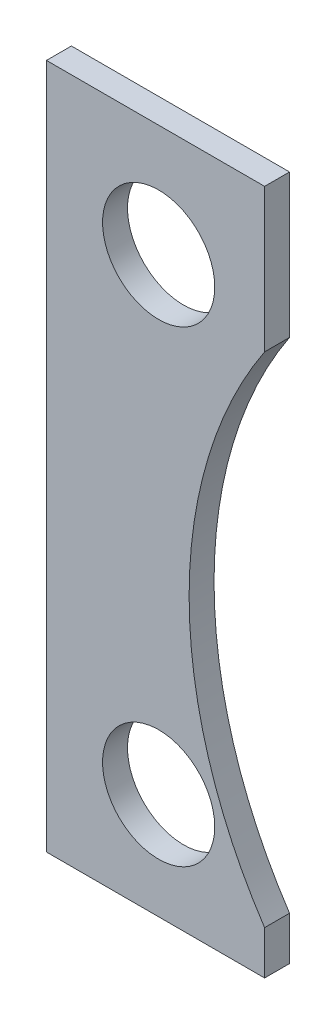
ISO-10303-21;
HEADER;
FILE_DESCRIPTION(('STEP AP214'),'2;1');
FILE_NAME('part.step','',(''),(''),'','','');
FILE_SCHEMA(('AUTOMOTIVE_DESIGN { 1 0 10303 214 1 1 1 1 }'));
ENDSEC;
DATA;
#1=APPLICATION_CONTEXT('core data for automotive mechanical design processes');
#2=APPLICATION_PROTOCOL_DEFINITION('international standard','automotive_design',2000,#1);
#3=PRODUCT_CONTEXT('',#1,'mechanical');
#4=PRODUCT('Part','Part','',(#3));
#5=PRODUCT_RELATED_PRODUCT_CATEGORY('part','',(#4));
#6=PRODUCT_DEFINITION_FORMATION('','',#4);
#7=PRODUCT_DEFINITION_CONTEXT('part definition',#1,'design');
#8=PRODUCT_DEFINITION('design','',#6,#7);
#9=PRODUCT_DEFINITION_SHAPE('','',#8);
#10=(LENGTH_UNIT() NAMED_UNIT(*) SI_UNIT(.MILLI.,.METRE.));
#11=(NAMED_UNIT(*) PLANE_ANGLE_UNIT() SI_UNIT($,.RADIAN.));
#12=(NAMED_UNIT(*) SI_UNIT($,.STERADIAN.) SOLID_ANGLE_UNIT());
#13=UNCERTAINTY_MEASURE_WITH_UNIT(LENGTH_MEASURE(1.E-05),#10,'distance_accuracy_value','');
#14=(GEOMETRIC_REPRESENTATION_CONTEXT(3) GLOBAL_UNCERTAINTY_ASSIGNED_CONTEXT((#13)) GLOBAL_UNIT_ASSIGNED_CONTEXT((#10,
#11,#12)) REPRESENTATION_CONTEXT('',''));
#15=CARTESIAN_POINT('',(0.,0.,0.));
#16=DIRECTION('',(0.,0.,1.));
#17=DIRECTION('',(1.,0.,0.));
#18=AXIS2_PLACEMENT_3D('',#15,#16,#17);
#19=CARTESIAN_POINT('',(0.,110.,2.));
#20=DIRECTION('',(1.,0.,0.));
#21=DIRECTION('',(0.,1.,0.));
#22=AXIS2_PLACEMENT_3D('',#19,#20,#21);
#23=PLANE('',#22);
#24=DIRECTION('',(0.,-1.,0.));
#25=VECTOR('',#24,1.);
#26=CARTESIAN_POINT('',(0.,110.,-2.));
#27=LINE('',#26,#25);
#28=CARTESIAN_POINT('',(0.,110.,-2.));
#29=VERTEX_POINT('',#28);
#30=CARTESIAN_POINT('',(0.,0.,-2.));
#31=VERTEX_POINT('',#30);
#32=EDGE_CURVE('E121',#29,#31,#27,.T.);
#33=ORIENTED_EDGE('',*,*,#32,.T.);
#34=DIRECTION('',(0.,0.,-1.));
#35=VECTOR('',#34,1.);
#36=CARTESIAN_POINT('',(0.,0.,2.));
#37=LINE('',#36,#35);
#38=CARTESIAN_POINT('',(0.,0.,2.));
#39=VERTEX_POINT('',#38);
#40=EDGE_CURVE('E11',#39,#31,#37,.T.);
#41=ORIENTED_EDGE('',*,*,#40,.F.);
#42=DIRECTION('',(0.,-1.,0.));
#43=VECTOR('',#42,1.);
#44=CARTESIAN_POINT('',(0.,110.,2.));
#45=LINE('',#44,#43);
#46=CARTESIAN_POINT('',(0.,110.,2.));
#47=VERTEX_POINT('',#46);
#48=EDGE_CURVE('E132',#47,#39,#45,.T.);
#49=ORIENTED_EDGE('',*,*,#48,.F.);
#50=DIRECTION('',(0.,0.,-1.));
#51=VECTOR('',#50,1.);
#52=CARTESIAN_POINT('',(0.,110.,2.));
#53=LINE('',#52,#51);
#54=EDGE_CURVE('E117',#47,#29,#53,.T.);
#55=ORIENTED_EDGE('',*,*,#54,.T.);
#56=EDGE_LOOP('',(#33,#41,#49,#55));
#57=FACE_BOUND('',#56,.T.);
#58=ADVANCED_FACE('F37',(#57),#23,.F.);
#59=CARTESIAN_POINT('',(0.,0.,2.));
#60=DIRECTION('',(0.,1.,0.));
#61=DIRECTION('',(0.,0.,1.));
#62=AXIS2_PLACEMENT_3D('',#59,#60,#61);
#63=PLANE('',#62);
#64=DIRECTION('',(1.,0.,0.));
#65=VECTOR('',#64,1.);
#66=CARTESIAN_POINT('',(0.,0.,-2.));
#67=LINE('',#66,#65);
#68=CARTESIAN_POINT('',(35.,0.,-2.));
#69=VERTEX_POINT('',#68);
#70=EDGE_CURVE('E124',#31,#69,#67,.T.);
#71=ORIENTED_EDGE('',*,*,#70,.T.);
#72=DIRECTION('',(0.,0.,-1.));
#73=VECTOR('',#72,1.);
#74=CARTESIAN_POINT('',(35.,0.,2.));
#75=LINE('',#74,#73);
#76=CARTESIAN_POINT('',(35.,0.,2.));
#77=VERTEX_POINT('',#76);
#78=EDGE_CURVE('E45',#77,#69,#75,.T.);
#79=ORIENTED_EDGE('',*,*,#78,.F.);
#80=DIRECTION('',(1.,0.,0.));
#81=VECTOR('',#80,1.);
#82=CARTESIAN_POINT('',(0.,0.,2.));
#83=LINE('',#82,#81);
#84=EDGE_CURVE('E90',#39,#77,#83,.T.);
#85=ORIENTED_EDGE('',*,*,#84,.F.);
#86=ORIENTED_EDGE('',*,*,#40,.T.);
#87=EDGE_LOOP('',(#71,#79,#85,#86));
#88=FACE_BOUND('',#87,.T.);
#89=ADVANCED_FACE('F157',(#88),#63,.F.);
#90=CARTESIAN_POINT('',(35.,7.,2.));
#91=DIRECTION('',(-1.,0.,0.));
#92=DIRECTION('',(0.,-1.,0.));
#93=AXIS2_PLACEMENT_3D('',#90,#91,#92);
#94=PLANE('',#93);
#95=DIRECTION('',(0.,1.,0.));
#96=VECTOR('',#95,1.);
#97=CARTESIAN_POINT('',(35.,7.,-2.));
#98=LINE('',#97,#96);
#99=CARTESIAN_POINT('',(35.,7.00000000000003,-2.));
#100=VERTEX_POINT('',#99);
#101=EDGE_CURVE('E127',#69,#100,#98,.T.);
#102=ORIENTED_EDGE('',*,*,#101,.T.);
#103=DIRECTION('',(0.,0.,-1.));
#104=VECTOR('',#103,1.);
#105=CARTESIAN_POINT('',(35.,7.00000000000003,2.));
#106=LINE('',#105,#104);
#107=CARTESIAN_POINT('',(35.,7.00000000000003,2.));
#108=VERTEX_POINT('',#107);
#109=EDGE_CURVE('E112',#108,#100,#106,.T.);
#110=ORIENTED_EDGE('',*,*,#109,.F.);
#111=DIRECTION('',(0.,1.,0.));
#112=VECTOR('',#111,1.);
#113=CARTESIAN_POINT('',(35.,7.,2.));
#114=LINE('',#113,#112);
#115=EDGE_CURVE('E103',#77,#108,#114,.T.);
#116=ORIENTED_EDGE('',*,*,#115,.F.);
#117=ORIENTED_EDGE('',*,*,#78,.T.);
#118=EDGE_LOOP('',(#102,#110,#116,#117));
#119=FACE_BOUND('',#118,.T.);
#120=ADVANCED_FACE('F138',(#119),#94,.F.);
#121=CARTESIAN_POINT('',(95.0000000000002,47.,2.));
#122=DIRECTION('',(0.,0.,-1.));
#123=DIRECTION('',(-1.,0.,0.));
#124=AXIS2_PLACEMENT_3D('',#121,#122,#123);
#125=CYLINDRICAL_SURFACE('',#124,72.11102550928);
#126=CARTESIAN_POINT('',(95.0000000000002,47.,-2.));
#127=DIRECTION('',(0.,0.,-1.));
#128=DIRECTION('',(1.,0.,0.));
#129=AXIS2_PLACEMENT_3D('',#126,#127,#128);
#130=CIRCLE('',#129,72.11102550928);
#131=CARTESIAN_POINT('',(35.,87.,-2.));
#132=VERTEX_POINT('',#131);
#133=EDGE_CURVE('E111',#100,#132,#130,.T.);
#134=ORIENTED_EDGE('',*,*,#133,.T.);
#135=DIRECTION('',(0.,0.,-1.));
#136=VECTOR('',#135,1.);
#137=CARTESIAN_POINT('',(35.,87.,2.));
#138=LINE('',#137,#136);
#139=CARTESIAN_POINT('',(35.,87.,2.));
#140=VERTEX_POINT('',#139);
#141=EDGE_CURVE('E108',#140,#132,#138,.T.);
#142=ORIENTED_EDGE('',*,*,#141,.F.);
#143=CARTESIAN_POINT('',(95.0000000000002,47.,2.));
#144=DIRECTION('',(0.,0.,-1.));
#145=DIRECTION('',(1.,0.,0.));
#146=AXIS2_PLACEMENT_3D('',#143,#144,#145);
#147=CIRCLE('',#146,72.11102550928);
#148=EDGE_CURVE('E97',#108,#140,#147,.T.);
#149=ORIENTED_EDGE('',*,*,#148,.F.);
#150=ORIENTED_EDGE('',*,*,#109,.T.);
#151=EDGE_LOOP('',(#134,#142,#149,#150));
#152=FACE_BOUND('',#151,.T.);
#153=ADVANCED_FACE('F109',(#152),#125,.F.);
#154=CARTESIAN_POINT('',(35.,110.,2.));
#155=DIRECTION('',(-1.,0.,0.));
#156=DIRECTION('',(0.,0.,1.));
#157=AXIS2_PLACEMENT_3D('',#154,#155,#156);
#158=PLANE('',#157);
#159=DIRECTION('',(0.,1.,0.));
#160=VECTOR('',#159,1.);
#161=CARTESIAN_POINT('',(35.,110.,-2.));
#162=LINE('',#161,#160);
#163=CARTESIAN_POINT('',(35.,110.,-2.));
#164=VERTEX_POINT('',#163);
#165=EDGE_CURVE('E76',#132,#164,#162,.T.);
#166=ORIENTED_EDGE('',*,*,#165,.T.);
#167=DIRECTION('',(0.,0.,-1.));
#168=VECTOR('',#167,1.);
#169=CARTESIAN_POINT('',(35.,110.,2.));
#170=LINE('',#169,#168);
#171=CARTESIAN_POINT('',(35.,110.,2.));
#172=VERTEX_POINT('',#171);
#173=EDGE_CURVE('E113',#172,#164,#170,.T.);
#174=ORIENTED_EDGE('',*,*,#173,.F.);
#175=DIRECTION('',(0.,1.,0.));
#176=VECTOR('',#175,1.);
#177=CARTESIAN_POINT('',(35.,110.,2.));
#178=LINE('',#177,#176);
#179=EDGE_CURVE('E101',#140,#172,#178,.T.);
#180=ORIENTED_EDGE('',*,*,#179,.F.);
#181=ORIENTED_EDGE('',*,*,#141,.T.);
#182=EDGE_LOOP('',(#166,#174,#180,#181));
#183=FACE_BOUND('',#182,.T.);
#184=ADVANCED_FACE('F115',(#183),#158,.F.);
#185=CARTESIAN_POINT('',(0.,110.,2.));
#186=DIRECTION('',(0.,-1.,0.));
#187=DIRECTION('',(0.,0.,-1.));
#188=AXIS2_PLACEMENT_3D('',#185,#186,#187);
#189=PLANE('',#188);
#190=DIRECTION('',(-1.,0.,0.));
#191=VECTOR('',#190,1.);
#192=CARTESIAN_POINT('',(0.,110.,-2.));
#193=LINE('',#192,#191);
#194=EDGE_CURVE('E82',#164,#29,#193,.T.);
#195=ORIENTED_EDGE('',*,*,#194,.T.);
#196=ORIENTED_EDGE('',*,*,#54,.F.);
#197=DIRECTION('',(-1.,0.,0.));
#198=VECTOR('',#197,1.);
#199=CARTESIAN_POINT('',(0.,110.,2.));
#200=LINE('',#199,#198);
#201=EDGE_CURVE('E53',#172,#47,#200,.T.);
#202=ORIENTED_EDGE('',*,*,#201,.F.);
#203=ORIENTED_EDGE('',*,*,#173,.T.);
#204=EDGE_LOOP('',(#195,#196,#202,#203));
#205=FACE_BOUND('',#204,.T.);
#206=ADVANCED_FACE('F145',(#205),#189,.F.);
#207=CARTESIAN_POINT('',(95.0000000000002,47.,2.));
#208=DIRECTION('',(0.,0.,1.));
#209=DIRECTION('',(1.,0.,0.));
#210=AXIS2_PLACEMENT_3D('',#207,#208,#209);
#211=PLANE('',#210);
#212=CARTESIAN_POINT('',(18.0000000000002,92.,2.));
#213=DIRECTION('',(0.,0.,1.));
#214=DIRECTION('',(1.,0.,0.));
#215=AXIS2_PLACEMENT_3D('',#212,#213,#214);
#216=CIRCLE('',#215,9.00000000000001);
#217=CARTESIAN_POINT('',(27.0000000000002,92.,2.));
#218=VERTEX_POINT('',#217);
#219=EDGE_CURVE('E222',#218,#218,#216,.T.);
#220=ORIENTED_EDGE('',*,*,#219,.F.);
#221=EDGE_LOOP('',(#220));
#222=FACE_BOUND('',#221,.T.);
#223=CARTESIAN_POINT('',(18.0000000000002,17.,2.));
#224=DIRECTION('',(0.,0.,1.));
#225=DIRECTION('',(1.,0.,0.));
#226=AXIS2_PLACEMENT_3D('',#223,#224,#225);
#227=CIRCLE('',#226,9.);
#228=CARTESIAN_POINT('',(27.0000000000002,17.,2.));
#229=VERTEX_POINT('',#228);
#230=EDGE_CURVE('E227',#229,#229,#227,.T.);
#231=ORIENTED_EDGE('',*,*,#230,.F.);
#232=EDGE_LOOP('',(#231));
#233=FACE_BOUND('',#232,.T.);
#234=ORIENTED_EDGE('',*,*,#48,.T.);
#235=ORIENTED_EDGE('',*,*,#84,.T.);
#236=ORIENTED_EDGE('',*,*,#115,.T.);
#237=ORIENTED_EDGE('',*,*,#148,.T.);
#238=ORIENTED_EDGE('',*,*,#179,.T.);
#239=ORIENTED_EDGE('',*,*,#201,.T.);
#240=EDGE_LOOP('',(#234,#235,#236,#237,#238,#239));
#241=FACE_BOUND('',#240,.T.);
#242=ADVANCED_FACE('F99',(#222,#233,#241),#211,.T.);
#243=CARTESIAN_POINT('',(95.0000000000002,47.,-2.));
#244=DIRECTION('',(0.,0.,1.));
#245=DIRECTION('',(1.,0.,0.));
#246=AXIS2_PLACEMENT_3D('',#243,#244,#245);
#247=PLANE('',#246);
#248=CARTESIAN_POINT('',(18.0000000000002,92.,-2.));
#249=DIRECTION('',(0.,0.,1.));
#250=DIRECTION('',(1.,0.,0.));
#251=AXIS2_PLACEMENT_3D('',#248,#249,#250);
#252=CIRCLE('',#251,9.00000000000001);
#253=CARTESIAN_POINT('',(27.0000000000002,92.,-2.));
#254=VERTEX_POINT('',#253);
#255=EDGE_CURVE('E125',#254,#254,#252,.T.);
#256=ORIENTED_EDGE('',*,*,#255,.T.);
#257=EDGE_LOOP('',(#256));
#258=FACE_BOUND('',#257,.T.);
#259=CARTESIAN_POINT('',(18.0000000000002,17.,-2.));
#260=DIRECTION('',(0.,0.,1.));
#261=DIRECTION('',(1.,0.,0.));
#262=AXIS2_PLACEMENT_3D('',#259,#260,#261);
#263=CIRCLE('',#262,9.);
#264=CARTESIAN_POINT('',(27.0000000000002,17.,-2.));
#265=VERTEX_POINT('',#264);
#266=EDGE_CURVE('E223',#265,#265,#263,.T.);
#267=ORIENTED_EDGE('',*,*,#266,.T.);
#268=EDGE_LOOP('',(#267));
#269=FACE_BOUND('',#268,.T.);
#270=ORIENTED_EDGE('',*,*,#32,.F.);
#271=ORIENTED_EDGE('',*,*,#194,.F.);
#272=ORIENTED_EDGE('',*,*,#165,.F.);
#273=ORIENTED_EDGE('',*,*,#133,.F.);
#274=ORIENTED_EDGE('',*,*,#101,.F.);
#275=ORIENTED_EDGE('',*,*,#70,.F.);
#276=EDGE_LOOP('',(#270,#271,#272,#273,#274,#275));
#277=FACE_BOUND('',#276,.T.);
#278=ADVANCED_FACE('F141',(#258,#269,#277),#247,.F.);
#279=CARTESIAN_POINT('',(18.0000000000002,17.,-2.));
#280=DIRECTION('',(0.,0.,1.));
#281=DIRECTION('',(1.,0.,0.));
#282=AXIS2_PLACEMENT_3D('',#279,#280,#281);
#283=CYLINDRICAL_SURFACE('',#282,9.);
#284=ORIENTED_EDGE('',*,*,#266,.F.);
#285=EDGE_LOOP('',(#284));
#286=FACE_BOUND('',#285,.T.);
#287=ORIENTED_EDGE('',*,*,#230,.T.);
#288=EDGE_LOOP('',(#287));
#289=FACE_BOUND('',#288,.T.);
#290=ADVANCED_FACE('F194',(#286,#289),#283,.F.);
#291=CARTESIAN_POINT('',(18.0000000000002,92.,-2.));
#292=DIRECTION('',(0.,0.,1.));
#293=DIRECTION('',(1.,0.,0.));
#294=AXIS2_PLACEMENT_3D('',#291,#292,#293);
#295=CYLINDRICAL_SURFACE('',#294,9.00000000000001);
#296=ORIENTED_EDGE('',*,*,#255,.F.);
#297=EDGE_LOOP('',(#296));
#298=FACE_BOUND('',#297,.T.);
#299=ORIENTED_EDGE('',*,*,#219,.T.);
#300=EDGE_LOOP('',(#299));
#301=FACE_BOUND('',#300,.T.);
#302=ADVANCED_FACE('F203',(#298,#301),#295,.F.);
#303=CLOSED_SHELL('',(#58,#89,#120,#153,#184,#206,#242,#278,#290,#302));
#304=MANIFOLD_SOLID_BREP('B2',#303);
#305=ADVANCED_BREP_SHAPE_REPRESENTATION('',(#18,#304),#14);
#306=SHAPE_DEFINITION_REPRESENTATION(#9,#305);
ENDSEC;
END-ISO-10303-21;
